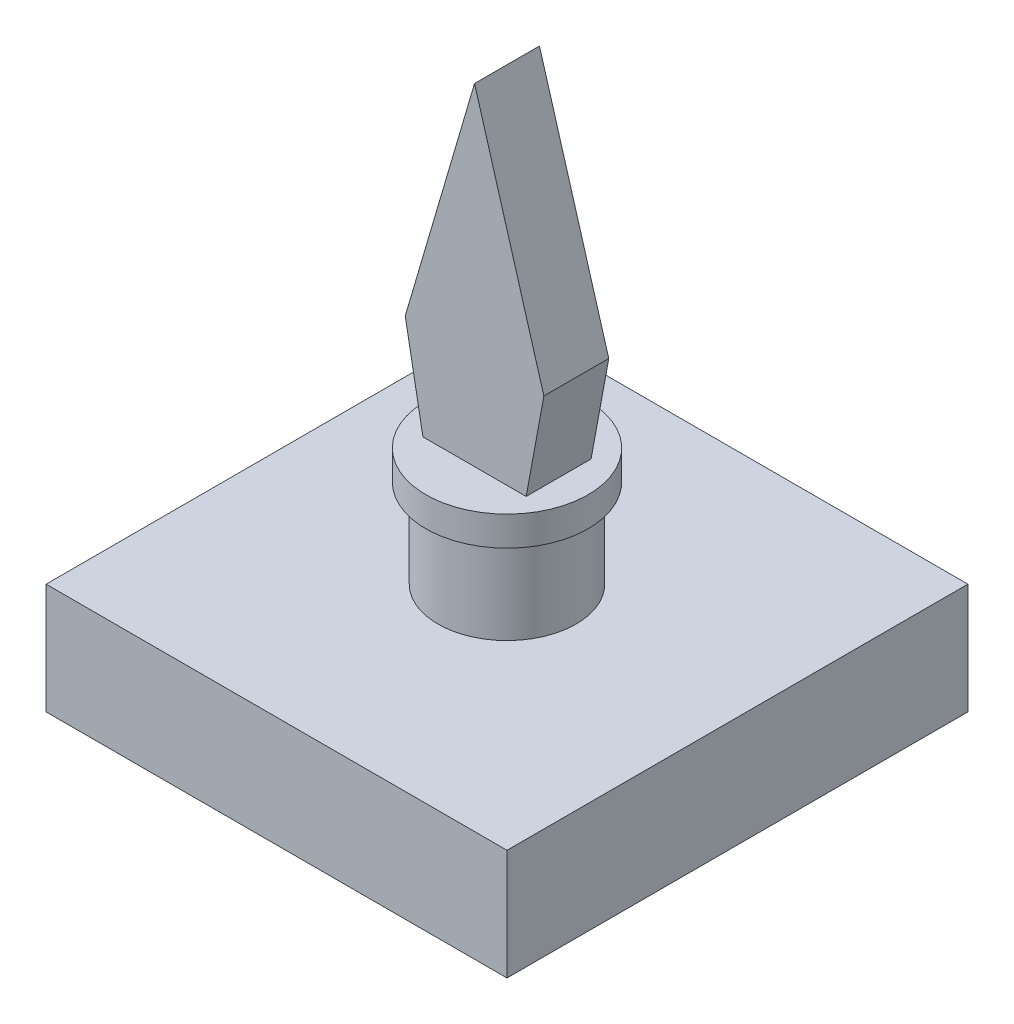
ISO-10303-21;
HEADER;
FILE_DESCRIPTION(('STEP AP214'),'2;1');
FILE_NAME('part.step','',(''),(''),'','','');
FILE_SCHEMA(('AUTOMOTIVE_DESIGN { 1 0 10303 214 1 1 1 1 }'));
ENDSEC;
DATA;
#1=APPLICATION_CONTEXT('core data for automotive mechanical design processes');
#2=APPLICATION_PROTOCOL_DEFINITION('international standard','automotive_design',2000,#1);
#3=PRODUCT_CONTEXT('',#1,'mechanical');
#4=PRODUCT('Part','Part','',(#3));
#5=PRODUCT_RELATED_PRODUCT_CATEGORY('part','',(#4));
#6=PRODUCT_DEFINITION_FORMATION('','',#4);
#7=PRODUCT_DEFINITION_CONTEXT('part definition',#1,'design');
#8=PRODUCT_DEFINITION('design','',#6,#7);
#9=PRODUCT_DEFINITION_SHAPE('','',#8);
#10=(LENGTH_UNIT() NAMED_UNIT(*) SI_UNIT(.MILLI.,.METRE.));
#11=(NAMED_UNIT(*) PLANE_ANGLE_UNIT() SI_UNIT($,.RADIAN.));
#12=(NAMED_UNIT(*) SI_UNIT($,.STERADIAN.) SOLID_ANGLE_UNIT());
#13=UNCERTAINTY_MEASURE_WITH_UNIT(LENGTH_MEASURE(1.E-05),#10,'distance_accuracy_value','');
#14=(GEOMETRIC_REPRESENTATION_CONTEXT(3) GLOBAL_UNCERTAINTY_ASSIGNED_CONTEXT((#13)) GLOBAL_UNIT_ASSIGNED_CONTEXT((#10,
#11,#12)) REPRESENTATION_CONTEXT('',''));
#15=CARTESIAN_POINT('',(0.,0.,0.));
#16=DIRECTION('',(0.,0.,1.));
#17=DIRECTION('',(1.,0.,0.));
#18=AXIS2_PLACEMENT_3D('',#15,#16,#17);
#19=CARTESIAN_POINT('',(0.,3.2,0.));
#20=DIRECTION('',(0.,1.,0.));
#21=DIRECTION('',(0.,0.,1.));
#22=AXIS2_PLACEMENT_3D('',#19,#20,#21);
#23=PLANE('',#22);
#24=CARTESIAN_POINT('',(0.,3.2,0.));
#25=DIRECTION('',(0.,-1.,0.));
#26=DIRECTION('',(0.,0.,-1.));
#27=AXIS2_PLACEMENT_3D('',#24,#25,#26);
#28=CIRCLE('',#27,2.2);
#29=CARTESIAN_POINT('',(0.,3.2,-2.2));
#30=VERTEX_POINT('',#29);
#31=EDGE_CURVE('E158',#30,#30,#28,.T.);
#32=ORIENTED_EDGE('',*,*,#31,.F.);
#33=EDGE_LOOP('',(#32));
#34=FACE_BOUND('',#33,.T.);
#35=DIRECTION('',(0.,0.,-1.));
#36=VECTOR('',#35,1.);
#37=CARTESIAN_POINT('',(-1.4,3.2,0.88));
#38=LINE('',#37,#36);
#39=CARTESIAN_POINT('',(-1.4,3.2,0.88));
#40=VERTEX_POINT('',#39);
#41=CARTESIAN_POINT('',(-1.4,3.2,-0.88));
#42=VERTEX_POINT('',#41);
#43=EDGE_CURVE('E126',#40,#42,#38,.T.);
#44=ORIENTED_EDGE('',*,*,#43,.T.);
#45=DIRECTION('',(1.,0.,0.));
#46=VECTOR('',#45,1.);
#47=CARTESIAN_POINT('',(1.4,3.2,-0.88));
#48=LINE('',#47,#46);
#49=CARTESIAN_POINT('',(1.4,3.2,-0.88));
#50=VERTEX_POINT('',#49);
#51=EDGE_CURVE('E56',#42,#50,#48,.T.);
#52=ORIENTED_EDGE('',*,*,#51,.T.);
#53=DIRECTION('',(0.,0.,-1.));
#54=VECTOR('',#53,1.);
#55=CARTESIAN_POINT('',(1.4,3.2,0.88));
#56=LINE('',#55,#54);
#57=CARTESIAN_POINT('',(1.4,3.2,0.88));
#58=VERTEX_POINT('',#57);
#59=EDGE_CURVE('E149',#58,#50,#56,.T.);
#60=ORIENTED_EDGE('',*,*,#59,.F.);
#61=DIRECTION('',(1.,0.,0.));
#62=VECTOR('',#61,1.);
#63=CARTESIAN_POINT('',(1.4,3.2,0.88));
#64=LINE('',#63,#62);
#65=EDGE_CURVE('E129',#40,#58,#64,.T.);
#66=ORIENTED_EDGE('',*,*,#65,.F.);
#67=EDGE_LOOP('',(#44,#52,#60,#66));
#68=FACE_BOUND('',#67,.T.);
#69=ADVANCED_FACE('F39',(#34,#68),#23,.T.);
#70=CARTESIAN_POINT('',(6.25,-3.,6.25));
#71=DIRECTION('',(1.,0.,0.));
#72=DIRECTION('',(0.,0.,-1.));
#73=AXIS2_PLACEMENT_3D('',#70,#71,#72);
#74=PLANE('',#73);
#75=DIRECTION('',(0.,0.,-1.));
#76=VECTOR('',#75,1.);
#77=CARTESIAN_POINT('',(6.25,0.,6.25));
#78=LINE('',#77,#76);
#79=CARTESIAN_POINT('',(6.25,0.,6.25));
#80=VERTEX_POINT('',#79);
#81=CARTESIAN_POINT('',(6.25,0.,-6.25));
#82=VERTEX_POINT('',#81);
#83=EDGE_CURVE('E161',#80,#82,#78,.T.);
#84=ORIENTED_EDGE('',*,*,#83,.F.);
#85=DIRECTION('',(0.,1.,0.));
#86=VECTOR('',#85,1.);
#87=CARTESIAN_POINT('',(6.25,-3.,6.25));
#88=LINE('',#87,#86);
#89=CARTESIAN_POINT('',(6.25,-3.,6.25));
#90=VERTEX_POINT('',#89);
#91=EDGE_CURVE('E11',#90,#80,#88,.T.);
#92=ORIENTED_EDGE('',*,*,#91,.F.);
#93=DIRECTION('',(0.,0.,-1.));
#94=VECTOR('',#93,1.);
#95=CARTESIAN_POINT('',(6.25,-3.,6.25));
#96=LINE('',#95,#94);
#97=CARTESIAN_POINT('',(6.25,-3.,-6.25));
#98=VERTEX_POINT('',#97);
#99=EDGE_CURVE('E162',#90,#98,#96,.T.);
#100=ORIENTED_EDGE('',*,*,#99,.T.);
#101=DIRECTION('',(0.,1.,0.));
#102=VECTOR('',#101,1.);
#103=CARTESIAN_POINT('',(6.25,-3.,-6.25));
#104=LINE('',#103,#102);
#105=EDGE_CURVE('E43',#98,#82,#104,.T.);
#106=ORIENTED_EDGE('',*,*,#105,.T.);
#107=EDGE_LOOP('',(#84,#92,#100,#106));
#108=FACE_BOUND('',#107,.T.);
#109=ADVANCED_FACE('F41',(#108),#74,.T.);
#110=CARTESIAN_POINT('',(-6.25,-3.,6.25));
#111=DIRECTION('',(0.,0.,1.));
#112=DIRECTION('',(1.,0.,0.));
#113=AXIS2_PLACEMENT_3D('',#110,#111,#112);
#114=PLANE('',#113);
#115=DIRECTION('',(1.,0.,0.));
#116=VECTOR('',#115,1.);
#117=CARTESIAN_POINT('',(-6.25,0.,6.25));
#118=LINE('',#117,#116);
#119=CARTESIAN_POINT('',(-6.25,0.,6.25));
#120=VERTEX_POINT('',#119);
#121=EDGE_CURVE('E165',#120,#80,#118,.T.);
#122=ORIENTED_EDGE('',*,*,#121,.F.);
#123=DIRECTION('',(0.,1.,0.));
#124=VECTOR('',#123,1.);
#125=CARTESIAN_POINT('',(-6.25,-3.,6.25));
#126=LINE('',#125,#124);
#127=CARTESIAN_POINT('',(-6.25,-3.,6.25));
#128=VERTEX_POINT('',#127);
#129=EDGE_CURVE('E48',#128,#120,#126,.T.);
#130=ORIENTED_EDGE('',*,*,#129,.F.);
#131=DIRECTION('',(1.,0.,0.));
#132=VECTOR('',#131,1.);
#133=CARTESIAN_POINT('',(-6.25,-3.,6.25));
#134=LINE('',#133,#132);
#135=EDGE_CURVE('E170',#128,#90,#134,.T.);
#136=ORIENTED_EDGE('',*,*,#135,.T.);
#137=ORIENTED_EDGE('',*,*,#91,.T.);
#138=EDGE_LOOP('',(#122,#130,#136,#137));
#139=FACE_BOUND('',#138,.T.);
#140=ADVANCED_FACE('F187',(#139),#114,.T.);
#141=CARTESIAN_POINT('',(-6.25,-3.,6.25));
#142=DIRECTION('',(-1.,0.,0.));
#143=DIRECTION('',(0.,0.,1.));
#144=AXIS2_PLACEMENT_3D('',#141,#142,#143);
#145=PLANE('',#144);
#146=DIRECTION('',(0.,0.,1.));
#147=VECTOR('',#146,1.);
#148=CARTESIAN_POINT('',(-6.25,0.,6.25));
#149=LINE('',#148,#147);
#150=CARTESIAN_POINT('',(-6.25,0.,-6.25));
#151=VERTEX_POINT('',#150);
#152=EDGE_CURVE('E177',#151,#120,#149,.T.);
#153=ORIENTED_EDGE('',*,*,#152,.F.);
#154=DIRECTION('',(0.,1.,0.));
#155=VECTOR('',#154,1.);
#156=CARTESIAN_POINT('',(-6.25,-3.,-6.25));
#157=LINE('',#156,#155);
#158=CARTESIAN_POINT('',(-6.25,-3.,-6.25));
#159=VERTEX_POINT('',#158);
#160=EDGE_CURVE('E182',#159,#151,#157,.T.);
#161=ORIENTED_EDGE('',*,*,#160,.F.);
#162=DIRECTION('',(0.,0.,1.));
#163=VECTOR('',#162,1.);
#164=CARTESIAN_POINT('',(-6.25,-3.,6.25));
#165=LINE('',#164,#163);
#166=EDGE_CURVE('E167',#159,#128,#165,.T.);
#167=ORIENTED_EDGE('',*,*,#166,.T.);
#168=ORIENTED_EDGE('',*,*,#129,.T.);
#169=EDGE_LOOP('',(#153,#161,#167,#168));
#170=FACE_BOUND('',#169,.T.);
#171=ADVANCED_FACE('F191',(#170),#145,.T.);
#172=CARTESIAN_POINT('',(-6.25,-3.,-6.25));
#173=DIRECTION('',(0.,0.,-1.));
#174=DIRECTION('',(-1.,0.,0.));
#175=AXIS2_PLACEMENT_3D('',#172,#173,#174);
#176=PLANE('',#175);
#177=DIRECTION('',(-1.,0.,0.));
#178=VECTOR('',#177,1.);
#179=CARTESIAN_POINT('',(-6.25,0.,-6.25));
#180=LINE('',#179,#178);
#181=EDGE_CURVE('E174',#82,#151,#180,.T.);
#182=ORIENTED_EDGE('',*,*,#181,.F.);
#183=ORIENTED_EDGE('',*,*,#105,.F.);
#184=DIRECTION('',(-1.,0.,0.));
#185=VECTOR('',#184,1.);
#186=CARTESIAN_POINT('',(-6.25,-3.,-6.25));
#187=LINE('',#186,#185);
#188=EDGE_CURVE('E164',#98,#159,#187,.T.);
#189=ORIENTED_EDGE('',*,*,#188,.T.);
#190=ORIENTED_EDGE('',*,*,#160,.T.);
#191=EDGE_LOOP('',(#182,#183,#189,#190));
#192=FACE_BOUND('',#191,.T.);
#193=ADVANCED_FACE('F184',(#192),#176,.T.);
#194=CARTESIAN_POINT('',(0.,-3.,0.));
#195=DIRECTION('',(0.,-1.,0.));
#196=DIRECTION('',(0.,0.,-1.));
#197=AXIS2_PLACEMENT_3D('',#194,#195,#196);
#198=PLANE('',#197);
#199=ORIENTED_EDGE('',*,*,#99,.F.);
#200=ORIENTED_EDGE('',*,*,#135,.F.);
#201=ORIENTED_EDGE('',*,*,#166,.F.);
#202=ORIENTED_EDGE('',*,*,#188,.F.);
#203=EDGE_LOOP('',(#199,#200,#201,#202));
#204=FACE_BOUND('',#203,.T.);
#205=ADVANCED_FACE('F193',(#204),#198,.T.);
#206=CARTESIAN_POINT('',(0.,0.,0.));
#207=DIRECTION('',(0.,-1.,0.));
#208=DIRECTION('',(0.,0.,-1.));
#209=AXIS2_PLACEMENT_3D('',#206,#207,#208);
#210=PLANE('',#209);
#211=CARTESIAN_POINT('',(0.,0.,0.));
#212=DIRECTION('',(0.,-1.,0.));
#213=DIRECTION('',(0.,0.,-1.));
#214=AXIS2_PLACEMENT_3D('',#211,#212,#213);
#215=CIRCLE('',#214,1.875);
#216=CARTESIAN_POINT('',(0.,0.,-1.875));
#217=VERTEX_POINT('',#216);
#218=EDGE_CURVE('E144',#217,#217,#215,.T.);
#219=ORIENTED_EDGE('',*,*,#218,.T.);
#220=EDGE_LOOP('',(#219));
#221=FACE_BOUND('',#220,.T.);
#222=ORIENTED_EDGE('',*,*,#83,.T.);
#223=ORIENTED_EDGE('',*,*,#181,.T.);
#224=ORIENTED_EDGE('',*,*,#152,.T.);
#225=ORIENTED_EDGE('',*,*,#121,.T.);
#226=EDGE_LOOP('',(#222,#223,#224,#225));
#227=FACE_BOUND('',#226,.T.);
#228=ADVANCED_FACE('F186',(#221,#227),#210,.F.);
#229=CARTESIAN_POINT('',(0.,-3.,0.));
#230=DIRECTION('',(0.,-1.,0.));
#231=DIRECTION('',(0.,0.,-1.));
#232=AXIS2_PLACEMENT_3D('',#229,#230,#231);
#233=CYLINDRICAL_SURFACE('',#232,2.2);
#234=ORIENTED_EDGE('',*,*,#31,.T.);
#235=EDGE_LOOP('',(#234));
#236=FACE_BOUND('',#235,.T.);
#237=CARTESIAN_POINT('',(0.,2.4,0.));
#238=DIRECTION('',(0.,-1.,0.));
#239=DIRECTION('',(0.,0.,-1.));
#240=AXIS2_PLACEMENT_3D('',#237,#238,#239);
#241=CIRCLE('',#240,2.2);
#242=CARTESIAN_POINT('',(0.,2.4,-2.2));
#243=VERTEX_POINT('',#242);
#244=EDGE_CURVE('E155',#243,#243,#241,.T.);
#245=ORIENTED_EDGE('',*,*,#244,.F.);
#246=EDGE_LOOP('',(#245));
#247=FACE_BOUND('',#246,.T.);
#248=ADVANCED_FACE('F200',(#236,#247),#233,.T.);
#249=CARTESIAN_POINT('',(2.2,2.4,0.));
#250=DIRECTION('',(0.,-1.,0.));
#251=DIRECTION('',(0.,0.,-1.));
#252=AXIS2_PLACEMENT_3D('',#249,#250,#251);
#253=PLANE('',#252);
#254=ORIENTED_EDGE('',*,*,#244,.T.);
#255=EDGE_LOOP('',(#254));
#256=FACE_BOUND('',#255,.T.);
#257=CARTESIAN_POINT('',(0.,2.4,0.));
#258=DIRECTION('',(0.,-1.,0.));
#259=DIRECTION('',(0.,0.,-1.));
#260=AXIS2_PLACEMENT_3D('',#257,#258,#259);
#261=CIRCLE('',#260,1.875);
#262=CARTESIAN_POINT('',(0.,2.4,-1.875));
#263=VERTEX_POINT('',#262);
#264=EDGE_CURVE('E147',#263,#263,#261,.T.);
#265=ORIENTED_EDGE('',*,*,#264,.F.);
#266=EDGE_LOOP('',(#265));
#267=FACE_BOUND('',#266,.T.);
#268=ADVANCED_FACE('F216',(#256,#267),#253,.T.);
#269=CARTESIAN_POINT('',(0.,-3.,0.));
#270=DIRECTION('',(0.,-1.,0.));
#271=DIRECTION('',(0.,0.,-1.));
#272=AXIS2_PLACEMENT_3D('',#269,#270,#271);
#273=CYLINDRICAL_SURFACE('',#272,1.875);
#274=ORIENTED_EDGE('',*,*,#264,.T.);
#275=EDGE_LOOP('',(#274));
#276=FACE_BOUND('',#275,.T.);
#277=ORIENTED_EDGE('',*,*,#218,.F.);
#278=EDGE_LOOP('',(#277));
#279=FACE_BOUND('',#278,.T.);
#280=ADVANCED_FACE('F220',(#276,#279),#273,.T.);
#281=CARTESIAN_POINT('',(0.,12.2,0.88));
#282=DIRECTION('',(0.959460934389768,-0.281841649476994,0.));
#283=DIRECTION('',(0.281841649476994,0.959460934389768,0.));
#284=AXIS2_PLACEMENT_3D('',#281,#282,#283);
#285=PLANE('',#284);
#286=DIRECTION('',(-0.281841649476994,-0.959460934389768,0.));
#287=VECTOR('',#286,1.);
#288=CARTESIAN_POINT('',(0.,12.2,-0.88));
#289=LINE('',#288,#287);
#290=CARTESIAN_POINT('',(0.,12.2,-0.88));
#291=VERTEX_POINT('',#290);
#292=CARTESIAN_POINT('',(-1.88,5.8,-0.88));
#293=VERTEX_POINT('',#292);
#294=EDGE_CURVE('E143',#291,#293,#289,.T.);
#295=ORIENTED_EDGE('',*,*,#294,.T.);
#296=DIRECTION('',(0.,0.,-1.));
#297=VECTOR('',#296,1.);
#298=CARTESIAN_POINT('',(-1.88,5.8,0.88));
#299=LINE('',#298,#297);
#300=CARTESIAN_POINT('',(-1.88,5.8,0.88));
#301=VERTEX_POINT('',#300);
#302=EDGE_CURVE('E123',#301,#293,#299,.T.);
#303=ORIENTED_EDGE('',*,*,#302,.F.);
#304=DIRECTION('',(-0.281841649476994,-0.959460934389768,0.));
#305=VECTOR('',#304,1.);
#306=CARTESIAN_POINT('',(0.,12.2,0.88));
#307=LINE('',#306,#305);
#308=CARTESIAN_POINT('',(0.,12.2,0.88));
#309=VERTEX_POINT('',#308);
#310=EDGE_CURVE('E130',#309,#301,#307,.T.);
#311=ORIENTED_EDGE('',*,*,#310,.F.);
#312=DIRECTION('',(0.,0.,-1.));
#313=VECTOR('',#312,1.);
#314=CARTESIAN_POINT('',(0.,12.2,0.88));
#315=LINE('',#314,#313);
#316=EDGE_CURVE('E346',#309,#291,#315,.T.);
#317=ORIENTED_EDGE('',*,*,#316,.T.);
#318=EDGE_LOOP('',(#295,#303,#311,#317));
#319=FACE_BOUND('',#318,.T.);
#320=ADVANCED_FACE('F141',(#319),#285,.F.);
#321=CARTESIAN_POINT('',(-1.88,5.8,0.88));
#322=DIRECTION('',(0.983382180387227,0.181547479456103,0.));
#323=DIRECTION('',(-0.181547479456103,0.983382180387226,0.));
#324=AXIS2_PLACEMENT_3D('',#321,#322,#323);
#325=PLANE('',#324);
#326=DIRECTION('',(0.181547479456103,-0.983382180387226,0.));
#327=VECTOR('',#326,1.);
#328=CARTESIAN_POINT('',(-1.88,5.8,-0.88));
#329=LINE('',#328,#327);
#330=EDGE_CURVE('E336',#293,#42,#329,.T.);
#331=ORIENTED_EDGE('',*,*,#330,.T.);
#332=ORIENTED_EDGE('',*,*,#43,.F.);
#333=DIRECTION('',(0.181547479456103,-0.983382180387226,0.));
#334=VECTOR('',#333,1.);
#335=CARTESIAN_POINT('',(-1.88,5.8,0.88));
#336=LINE('',#335,#334);
#337=EDGE_CURVE('E119',#301,#40,#336,.T.);
#338=ORIENTED_EDGE('',*,*,#337,.F.);
#339=ORIENTED_EDGE('',*,*,#302,.T.);
#340=EDGE_LOOP('',(#331,#332,#338,#339));
#341=FACE_BOUND('',#340,.T.);
#342=ADVANCED_FACE('F121',(#341),#325,.F.);
#343=CARTESIAN_POINT('',(1.88,5.8,0.88));
#344=DIRECTION('',(-0.983382180387227,0.181547479456103,0.));
#345=DIRECTION('',(-0.181547479456103,-0.983382180387226,0.));
#346=AXIS2_PLACEMENT_3D('',#343,#344,#345);
#347=PLANE('',#346);
#348=DIRECTION('',(0.181547479456103,0.983382180387226,0.));
#349=VECTOR('',#348,1.);
#350=CARTESIAN_POINT('',(1.88,5.8,-0.88));
#351=LINE('',#350,#349);
#352=CARTESIAN_POINT('',(1.88,5.8,-0.88));
#353=VERTEX_POINT('',#352);
#354=EDGE_CURVE('E343',#50,#353,#351,.T.);
#355=ORIENTED_EDGE('',*,*,#354,.T.);
#356=DIRECTION('',(0.,0.,-1.));
#357=VECTOR('',#356,1.);
#358=CARTESIAN_POINT('',(1.88,5.8,0.88));
#359=LINE('',#358,#357);
#360=CARTESIAN_POINT('',(1.88,5.8,0.88));
#361=VERTEX_POINT('',#360);
#362=EDGE_CURVE('E348',#361,#353,#359,.T.);
#363=ORIENTED_EDGE('',*,*,#362,.F.);
#364=DIRECTION('',(0.181547479456103,0.983382180387226,0.));
#365=VECTOR('',#364,1.);
#366=CARTESIAN_POINT('',(1.88,5.8,0.88));
#367=LINE('',#366,#365);
#368=EDGE_CURVE('E353',#58,#361,#367,.T.);
#369=ORIENTED_EDGE('',*,*,#368,.F.);
#370=ORIENTED_EDGE('',*,*,#59,.T.);
#371=EDGE_LOOP('',(#355,#363,#369,#370));
#372=FACE_BOUND('',#371,.T.);
#373=ADVANCED_FACE('F227',(#372),#347,.F.);
#374=CARTESIAN_POINT('',(0.,12.2,0.88));
#375=DIRECTION('',(-0.959460934389768,-0.281841649476994,0.));
#376=DIRECTION('',(0.281841649476994,-0.959460934389768,0.));
#377=AXIS2_PLACEMENT_3D('',#374,#375,#376);
#378=PLANE('',#377);
#379=DIRECTION('',(-0.281841649476994,0.959460934389768,0.));
#380=VECTOR('',#379,1.);
#381=CARTESIAN_POINT('',(0.,12.2,-0.88));
#382=LINE('',#381,#380);
#383=EDGE_CURVE('E139',#353,#291,#382,.T.);
#384=ORIENTED_EDGE('',*,*,#383,.T.);
#385=ORIENTED_EDGE('',*,*,#316,.F.);
#386=DIRECTION('',(-0.281841649476994,0.959460934389768,0.));
#387=VECTOR('',#386,1.);
#388=CARTESIAN_POINT('',(0.,12.2,0.88));
#389=LINE('',#388,#387);
#390=EDGE_CURVE('E135',#361,#309,#389,.T.);
#391=ORIENTED_EDGE('',*,*,#390,.F.);
#392=ORIENTED_EDGE('',*,*,#362,.T.);
#393=EDGE_LOOP('',(#384,#385,#391,#392));
#394=FACE_BOUND('',#393,.T.);
#395=ADVANCED_FACE('F230',(#394),#378,.F.);
#396=CARTESIAN_POINT('',(0.,0.,0.88));
#397=DIRECTION('',(0.,0.,-1.));
#398=DIRECTION('',(-1.,0.,0.));
#399=AXIS2_PLACEMENT_3D('',#396,#397,#398);
#400=PLANE('',#399);
#401=ORIENTED_EDGE('',*,*,#310,.T.);
#402=ORIENTED_EDGE('',*,*,#337,.T.);
#403=ORIENTED_EDGE('',*,*,#65,.T.);
#404=ORIENTED_EDGE('',*,*,#368,.T.);
#405=ORIENTED_EDGE('',*,*,#390,.T.);
#406=EDGE_LOOP('',(#401,#402,#403,#404,#405));
#407=FACE_BOUND('',#406,.T.);
#408=ADVANCED_FACE('F133',(#407),#400,.F.);
#409=CARTESIAN_POINT('',(0.,0.,-0.88));
#410=DIRECTION('',(0.,0.,-1.));
#411=DIRECTION('',(-1.,0.,0.));
#412=AXIS2_PLACEMENT_3D('',#409,#410,#411);
#413=PLANE('',#412);
#414=ORIENTED_EDGE('',*,*,#294,.F.);
#415=ORIENTED_EDGE('',*,*,#383,.F.);
#416=ORIENTED_EDGE('',*,*,#354,.F.);
#417=ORIENTED_EDGE('',*,*,#51,.F.);
#418=ORIENTED_EDGE('',*,*,#330,.F.);
#419=EDGE_LOOP('',(#414,#415,#416,#417,#418));
#420=FACE_BOUND('',#419,.T.);
#421=ADVANCED_FACE('F235',(#420),#413,.T.);
#422=CLOSED_SHELL('',(#69,#109,#140,#171,#193,#205,#228,#248,#268,#280,#320,#342,#373,#395,#408,#421));
#423=MANIFOLD_SOLID_BREP('B2',#422);
#424=ADVANCED_BREP_SHAPE_REPRESENTATION('',(#18,#423),#14);
#425=SHAPE_DEFINITION_REPRESENTATION(#9,#424);
ENDSEC;
END-ISO-10303-21;
